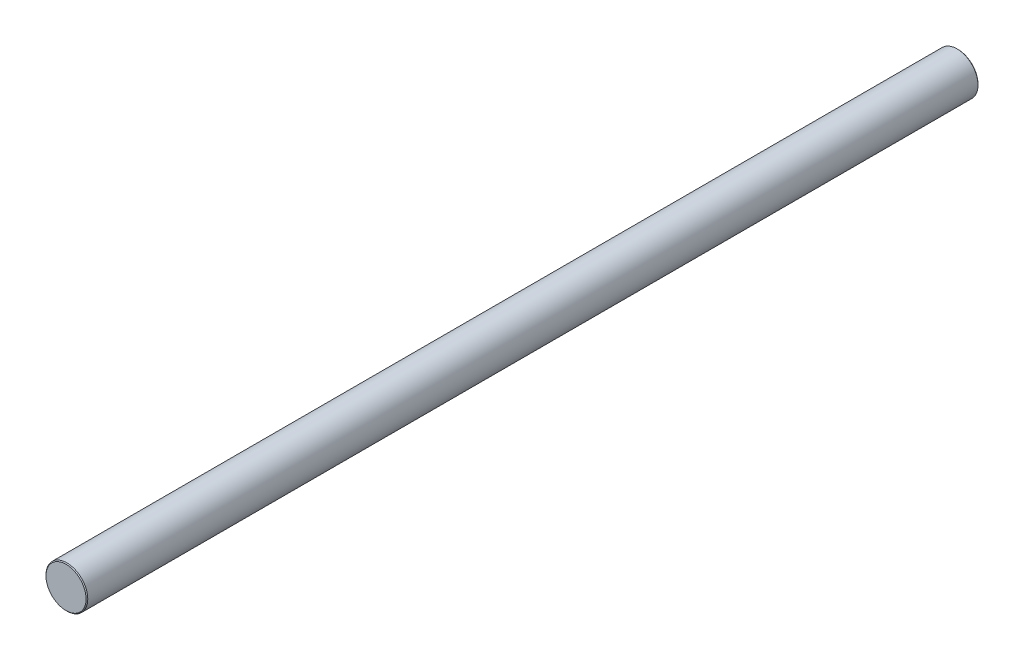
ISO-10303-21;
HEADER;
FILE_DESCRIPTION(('STEP AP214'),'2;1');
FILE_NAME('part.step','',(''),(''),'','','');
FILE_SCHEMA(('AUTOMOTIVE_DESIGN { 1 0 10303 214 1 1 1 1 }'));
ENDSEC;
DATA;
#1=APPLICATION_CONTEXT('core data for automotive mechanical design processes');
#2=APPLICATION_PROTOCOL_DEFINITION('international standard','automotive_design',2000,#1);
#3=PRODUCT_CONTEXT('',#1,'mechanical');
#4=PRODUCT('Part','Part','',(#3));
#5=PRODUCT_RELATED_PRODUCT_CATEGORY('part','',(#4));
#6=PRODUCT_DEFINITION_FORMATION('','',#4);
#7=PRODUCT_DEFINITION_CONTEXT('part definition',#1,'design');
#8=PRODUCT_DEFINITION('design','',#6,#7);
#9=PRODUCT_DEFINITION_SHAPE('','',#8);
#10=(LENGTH_UNIT() NAMED_UNIT(*) SI_UNIT(.MILLI.,.METRE.));
#11=(NAMED_UNIT(*) PLANE_ANGLE_UNIT() SI_UNIT($,.RADIAN.));
#12=(NAMED_UNIT(*) SI_UNIT($,.STERADIAN.) SOLID_ANGLE_UNIT());
#13=UNCERTAINTY_MEASURE_WITH_UNIT(LENGTH_MEASURE(1.E-05),#10,'distance_accuracy_value','');
#14=(GEOMETRIC_REPRESENTATION_CONTEXT(3) GLOBAL_UNCERTAINTY_ASSIGNED_CONTEXT((#13)) GLOBAL_UNIT_ASSIGNED_CONTEXT((#10,
#11,#12)) REPRESENTATION_CONTEXT('',''));
#15=CARTESIAN_POINT('',(0.,0.,0.));
#16=DIRECTION('',(0.,0.,1.));
#17=DIRECTION('',(1.,0.,0.));
#18=AXIS2_PLACEMENT_3D('',#15,#16,#17);
#19=CARTESIAN_POINT('',(0.,0.,101.6));
#20=DIRECTION('',(0.,0.,-1.));
#21=DIRECTION('',(-1.,0.,0.));
#22=AXIS2_PLACEMENT_3D('',#19,#20,#21);
#23=CYLINDRICAL_SURFACE('',#22,4.7625);
#24=CARTESIAN_POINT('',(0.,0.,-101.4095));
#25=DIRECTION('',(0.,0.,1.));
#26=DIRECTION('',(1.,0.,0.));
#27=AXIS2_PLACEMENT_3D('',#24,#25,#26);
#28=CIRCLE('',#27,4.7625);
#29=CARTESIAN_POINT('',(4.7625,0.,-101.4095));
#30=VERTEX_POINT('',#29);
#31=EDGE_CURVE('E42',#30,#30,#28,.T.);
#32=ORIENTED_EDGE('',*,*,#31,.T.);
#33=EDGE_LOOP('',(#32));
#34=FACE_BOUND('',#33,.T.);
#35=CARTESIAN_POINT('',(0.,0.,101.4095));
#36=DIRECTION('',(0.,0.,1.));
#37=DIRECTION('',(1.,0.,0.));
#38=AXIS2_PLACEMENT_3D('',#35,#36,#37);
#39=CIRCLE('',#38,4.7625);
#40=CARTESIAN_POINT('',(4.7625,0.,101.4095));
#41=VERTEX_POINT('',#40);
#42=EDGE_CURVE('E46',#41,#41,#39,.F.);
#43=ORIENTED_EDGE('',*,*,#42,.T.);
#44=EDGE_LOOP('',(#43));
#45=FACE_BOUND('',#44,.T.);
#46=ADVANCED_FACE('F31',(#34,#45),#23,.T.);
#47=CARTESIAN_POINT('',(0.,0.,101.6));
#48=DIRECTION('',(0.,0.,1.));
#49=DIRECTION('',(1.,0.,0.));
#50=AXIS2_PLACEMENT_3D('',#47,#48,#49);
#51=PLANE('',#50);
#52=CARTESIAN_POINT('',(0.,0.,101.6));
#53=DIRECTION('',(0.,0.,1.));
#54=DIRECTION('',(1.,0.,0.));
#55=AXIS2_PLACEMENT_3D('',#52,#53,#54);
#56=CIRCLE('',#55,4.57200000000002);
#57=CARTESIAN_POINT('',(4.57200000000002,0.,101.6));
#58=VERTEX_POINT('',#57);
#59=EDGE_CURVE('E10',#58,#58,#56,.T.);
#60=ORIENTED_EDGE('',*,*,#59,.T.);
#61=EDGE_LOOP('',(#60));
#62=FACE_BOUND('',#61,.T.);
#63=ADVANCED_FACE('F62',(#62),#51,.T.);
#64=CARTESIAN_POINT('',(0.,0.,-101.6));
#65=DIRECTION('',(0.,0.,1.));
#66=DIRECTION('',(1.,0.,0.));
#67=AXIS2_PLACEMENT_3D('',#64,#65,#66);
#68=PLANE('',#67);
#69=CARTESIAN_POINT('',(0.,0.,-101.6));
#70=DIRECTION('',(0.,0.,1.));
#71=DIRECTION('',(1.,0.,0.));
#72=AXIS2_PLACEMENT_3D('',#69,#70,#71);
#73=CIRCLE('',#72,4.57200000000002);
#74=CARTESIAN_POINT('',(4.57200000000002,0.,-101.6));
#75=VERTEX_POINT('',#74);
#76=EDGE_CURVE('E38',#75,#75,#73,.F.);
#77=ORIENTED_EDGE('',*,*,#76,.T.);
#78=EDGE_LOOP('',(#77));
#79=FACE_BOUND('',#78,.T.);
#80=ADVANCED_FACE('F59',(#79),#68,.F.);
#81=CARTESIAN_POINT('',(0.,0.,-101.4095));
#82=DIRECTION('',(0.,0.,1.));
#83=DIRECTION('',(1.,0.,0.));
#84=AXIS2_PLACEMENT_3D('',#81,#82,#83);
#85=CONICAL_SURFACE('',#84,4.7625,0.785398163397442);
#86=ORIENTED_EDGE('',*,*,#76,.F.);
#87=EDGE_LOOP('',(#86));
#88=FACE_BOUND('',#87,.T.);
#89=ORIENTED_EDGE('',*,*,#31,.F.);
#90=EDGE_LOOP('',(#89));
#91=FACE_BOUND('',#90,.T.);
#92=ADVANCED_FACE('F55',(#88,#91),#85,.T.);
#93=CARTESIAN_POINT('',(0.,0.,101.6));
#94=DIRECTION('',(0.,0.,-1.));
#95=DIRECTION('',(-1.,0.,0.));
#96=AXIS2_PLACEMENT_3D('',#93,#94,#95);
#97=CONICAL_SURFACE('',#96,4.57200000000002,0.785398163397442);
#98=ORIENTED_EDGE('',*,*,#42,.F.);
#99=EDGE_LOOP('',(#98));
#100=FACE_BOUND('',#99,.T.);
#101=ORIENTED_EDGE('',*,*,#59,.F.);
#102=EDGE_LOOP('',(#101));
#103=FACE_BOUND('',#102,.T.);
#104=ADVANCED_FACE('F33',(#100,#103),#97,.T.);
#105=CLOSED_SHELL('',(#46,#63,#80,#92,#104));
#106=MANIFOLD_SOLID_BREP('B2',#105);
#107=ADVANCED_BREP_SHAPE_REPRESENTATION('',(#18,#106),#14);
#108=SHAPE_DEFINITION_REPRESENTATION(#9,#107);
ENDSEC;
END-ISO-10303-21;
